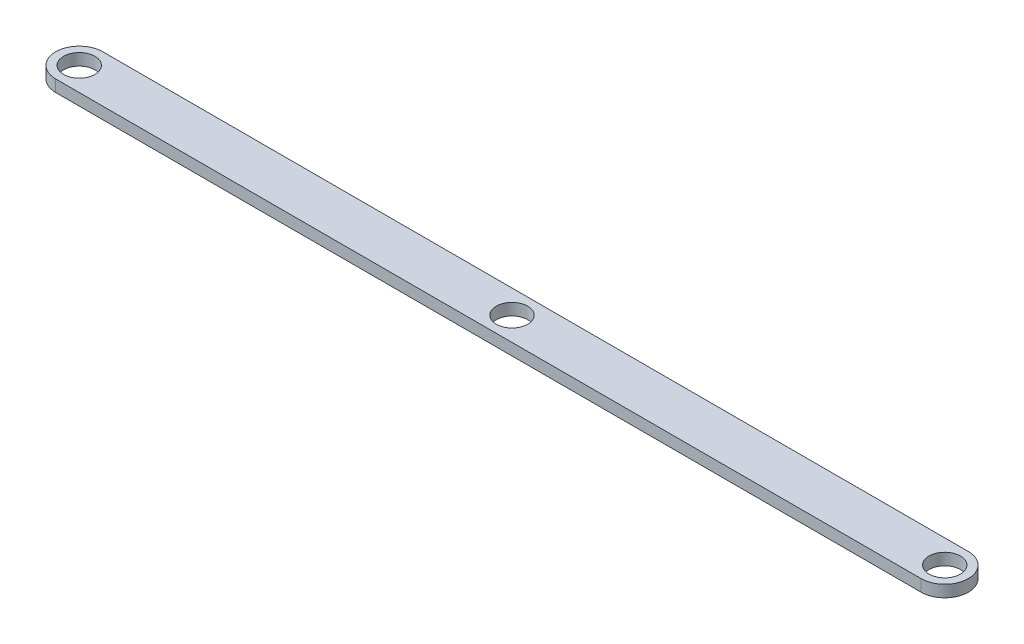
ISO-10303-21;
HEADER;
FILE_DESCRIPTION(('STEP AP214'),'2;1');
FILE_NAME('part.step','',(''),(''),'','','');
FILE_SCHEMA(('AUTOMOTIVE_DESIGN { 1 0 10303 214 1 1 1 1 }'));
ENDSEC;
DATA;
#1=APPLICATION_CONTEXT('core data for automotive mechanical design processes');
#2=APPLICATION_PROTOCOL_DEFINITION('international standard','automotive_design',2000,#1);
#3=PRODUCT_CONTEXT('',#1,'mechanical');
#4=PRODUCT('Part','Part','',(#3));
#5=PRODUCT_RELATED_PRODUCT_CATEGORY('part','',(#4));
#6=PRODUCT_DEFINITION_FORMATION('','',#4);
#7=PRODUCT_DEFINITION_CONTEXT('part definition',#1,'design');
#8=PRODUCT_DEFINITION('design','',#6,#7);
#9=PRODUCT_DEFINITION_SHAPE('','',#8);
#10=(LENGTH_UNIT() NAMED_UNIT(*) SI_UNIT(.MILLI.,.METRE.));
#11=(NAMED_UNIT(*) PLANE_ANGLE_UNIT() SI_UNIT($,.RADIAN.));
#12=(NAMED_UNIT(*) SI_UNIT($,.STERADIAN.) SOLID_ANGLE_UNIT());
#13=UNCERTAINTY_MEASURE_WITH_UNIT(LENGTH_MEASURE(1.E-05),#10,'distance_accuracy_value','');
#14=(GEOMETRIC_REPRESENTATION_CONTEXT(3) GLOBAL_UNCERTAINTY_ASSIGNED_CONTEXT((#13)) GLOBAL_UNIT_ASSIGNED_CONTEXT((#10,
#11,#12)) REPRESENTATION_CONTEXT('',''));
#15=CARTESIAN_POINT('',(0.,0.,0.));
#16=DIRECTION('',(0.,0.,1.));
#17=DIRECTION('',(1.,0.,0.));
#18=AXIS2_PLACEMENT_3D('',#15,#16,#17);
#19=CARTESIAN_POINT('',(0.,2.38125,4.7625));
#20=DIRECTION('',(0.,0.,-1.));
#21=DIRECTION('',(-1.,0.,0.));
#22=AXIS2_PLACEMENT_3D('',#19,#20,#21);
#23=PLANE('',#22);
#24=DIRECTION('',(1.,0.,0.));
#25=VECTOR('',#24,1.);
#26=CARTESIAN_POINT('',(0.,0.,4.7625));
#27=LINE('',#26,#25);
#28=CARTESIAN_POINT('',(-87.5,0.,4.7625));
#29=VERTEX_POINT('',#28);
#30=CARTESIAN_POINT('',(87.5,0.,4.7625));
#31=VERTEX_POINT('',#30);
#32=EDGE_CURVE('E122',#29,#31,#27,.T.);
#33=ORIENTED_EDGE('',*,*,#32,.T.);
#34=DIRECTION('',(0.,-1.,0.));
#35=VECTOR('',#34,1.);
#36=CARTESIAN_POINT('',(87.5,2.38125,4.7625));
#37=LINE('',#36,#35);
#38=CARTESIAN_POINT('',(87.5,2.38125,4.7625));
#39=VERTEX_POINT('',#38);
#40=EDGE_CURVE('E11',#39,#31,#37,.T.);
#41=ORIENTED_EDGE('',*,*,#40,.F.);
#42=DIRECTION('',(1.,0.,0.));
#43=VECTOR('',#42,1.);
#44=CARTESIAN_POINT('',(0.,2.38125,4.7625));
#45=LINE('',#44,#43);
#46=CARTESIAN_POINT('',(-87.5,2.38125,4.7625));
#47=VERTEX_POINT('',#46);
#48=EDGE_CURVE('E92',#47,#39,#45,.T.);
#49=ORIENTED_EDGE('',*,*,#48,.F.);
#50=DIRECTION('',(0.,-1.,0.));
#51=VECTOR('',#50,1.);
#52=CARTESIAN_POINT('',(-87.5,2.38125,4.7625));
#53=LINE('',#52,#51);
#54=EDGE_CURVE('E59',#47,#29,#53,.T.);
#55=ORIENTED_EDGE('',*,*,#54,.T.);
#56=EDGE_LOOP('',(#33,#41,#49,#55));
#57=FACE_BOUND('',#56,.T.);
#58=ADVANCED_FACE('F41',(#57),#23,.F.);
#59=CARTESIAN_POINT('',(87.5,2.38125,0.));
#60=DIRECTION('',(0.,-1.,0.));
#61=DIRECTION('',(0.,0.,-1.));
#62=AXIS2_PLACEMENT_3D('',#59,#60,#61);
#63=CYLINDRICAL_SURFACE('',#62,4.7625);
#64=CARTESIAN_POINT('',(87.5,0.,0.));
#65=DIRECTION('',(0.,1.,0.));
#66=DIRECTION('',(0.,0.,1.));
#67=AXIS2_PLACEMENT_3D('',#64,#65,#66);
#68=CIRCLE('',#67,4.7625);
#69=CARTESIAN_POINT('',(87.5,0.,-4.7625));
#70=VERTEX_POINT('',#69);
#71=EDGE_CURVE('E98',#31,#70,#68,.T.);
#72=ORIENTED_EDGE('',*,*,#71,.T.);
#73=DIRECTION('',(0.,-1.,0.));
#74=VECTOR('',#73,1.);
#75=CARTESIAN_POINT('',(87.5,2.38125,-4.7625));
#76=LINE('',#75,#74);
#77=CARTESIAN_POINT('',(87.5,2.38125,-4.7625));
#78=VERTEX_POINT('',#77);
#79=EDGE_CURVE('E51',#78,#70,#76,.T.);
#80=ORIENTED_EDGE('',*,*,#79,.F.);
#81=CARTESIAN_POINT('',(87.5,2.38125,0.));
#82=DIRECTION('',(0.,1.,0.));
#83=DIRECTION('',(0.,0.,1.));
#84=AXIS2_PLACEMENT_3D('',#81,#82,#83);
#85=CIRCLE('',#84,4.7625);
#86=EDGE_CURVE('E84',#39,#78,#85,.T.);
#87=ORIENTED_EDGE('',*,*,#86,.F.);
#88=ORIENTED_EDGE('',*,*,#40,.T.);
#89=EDGE_LOOP('',(#72,#80,#87,#88));
#90=FACE_BOUND('',#89,.T.);
#91=ADVANCED_FACE('F97',(#90),#63,.T.);
#92=CARTESIAN_POINT('',(0.,2.38125,-4.7625));
#93=DIRECTION('',(0.,0.,-1.));
#94=DIRECTION('',(-1.,0.,0.));
#95=AXIS2_PLACEMENT_3D('',#92,#93,#94);
#96=PLANE('',#95);
#97=DIRECTION('',(1.,0.,0.));
#98=VECTOR('',#97,1.);
#99=CARTESIAN_POINT('',(0.,0.,-4.7625));
#100=LINE('',#99,#98);
#101=CARTESIAN_POINT('',(-87.5,0.,-4.7625));
#102=VERTEX_POINT('',#101);
#103=EDGE_CURVE('E127',#102,#70,#100,.T.);
#104=ORIENTED_EDGE('',*,*,#103,.F.);
#105=DIRECTION('',(0.,-1.,0.));
#106=VECTOR('',#105,1.);
#107=CARTESIAN_POINT('',(-87.5,2.38125,-4.7625));
#108=LINE('',#107,#106);
#109=CARTESIAN_POINT('',(-87.5,2.38125,-4.7625));
#110=VERTEX_POINT('',#109);
#111=EDGE_CURVE('E73',#110,#102,#108,.T.);
#112=ORIENTED_EDGE('',*,*,#111,.F.);
#113=DIRECTION('',(1.,0.,0.));
#114=VECTOR('',#113,1.);
#115=CARTESIAN_POINT('',(0.,2.38125,-4.7625));
#116=LINE('',#115,#114);
#117=EDGE_CURVE('E91',#110,#78,#116,.T.);
#118=ORIENTED_EDGE('',*,*,#117,.T.);
#119=ORIENTED_EDGE('',*,*,#79,.T.);
#120=EDGE_LOOP('',(#104,#112,#118,#119));
#121=FACE_BOUND('',#120,.T.);
#122=ADVANCED_FACE('F102',(#121),#96,.T.);
#123=CARTESIAN_POINT('',(-87.5,2.38125,0.));
#124=DIRECTION('',(0.,-1.,0.));
#125=DIRECTION('',(0.,0.,-1.));
#126=AXIS2_PLACEMENT_3D('',#123,#124,#125);
#127=CYLINDRICAL_SURFACE('',#126,3.175);
#128=CARTESIAN_POINT('',(-87.5,2.38125,0.));
#129=DIRECTION('',(0.,1.,0.));
#130=DIRECTION('',(0.,0.,1.));
#131=AXIS2_PLACEMENT_3D('',#128,#129,#130);
#132=CIRCLE('',#131,3.175);
#133=CARTESIAN_POINT('',(-87.5,2.38125,-3.175));
#134=VERTEX_POINT('',#133);
#135=EDGE_CURVE('E147',#134,#134,#132,.T.);
#136=CARTESIAN_POINT('',(-87.5,0.,0.));
#137=DIRECTION('',(0.,1.,0.));
#138=DIRECTION('',(0.,0.,1.));
#139=AXIS2_PLACEMENT_3D('',#136,#137,#138);
#140=CIRCLE('',#139,3.175);
#141=CARTESIAN_POINT('',(-87.5,0.,-3.175));
#142=VERTEX_POINT('',#141);
#143=EDGE_CURVE('E118',#142,#142,#140,.T.);
#144=CARTESIAN_POINT('',(-87.5,2.38125,-3.175));
#145=CARTESIAN_POINT('',(-87.5,2.3564453125,-3.175));
#146=CARTESIAN_POINT('',(-87.5,2.331640625,-3.175));
#147=CARTESIAN_POINT('',(-87.5,2.28203125,-3.175));
#148=CARTESIAN_POINT('',(-87.5,2.2572265625,-3.175));
#149=CARTESIAN_POINT('',(-87.5,2.2076171875,-3.175));
#150=CARTESIAN_POINT('',(-87.5,2.1828125,-3.175));
#151=CARTESIAN_POINT('',(-87.5,2.133203125,-3.175));
#152=CARTESIAN_POINT('',(-87.5,2.1083984375,-3.175));
#153=CARTESIAN_POINT('',(-87.5,2.0587890625,-3.175));
#154=CARTESIAN_POINT('',(-87.5,2.033984375,-3.175));
#155=CARTESIAN_POINT('',(-87.5,1.984375,-3.175));
#156=CARTESIAN_POINT('',(-87.5,1.9595703125,-3.175));
#157=CARTESIAN_POINT('',(-87.5,1.9099609375,-3.175));
#158=CARTESIAN_POINT('',(-87.5,1.88515625,-3.175));
#159=CARTESIAN_POINT('',(-87.5,1.835546875,-3.175));
#160=CARTESIAN_POINT('',(-87.5,1.8107421875,-3.175));
#161=CARTESIAN_POINT('',(-87.5,1.7611328125,-3.175));
#162=CARTESIAN_POINT('',(-87.5,1.736328125,-3.175));
#163=CARTESIAN_POINT('',(-87.5,1.68671875,-3.175));
#164=CARTESIAN_POINT('',(-87.5,1.6619140625,-3.175));
#165=CARTESIAN_POINT('',(-87.5,1.6123046875,-3.175));
#166=CARTESIAN_POINT('',(-87.5,1.5875,-3.175));
#167=CARTESIAN_POINT('',(-87.5,1.537890625,-3.175));
#168=CARTESIAN_POINT('',(-87.5,1.5130859375,-3.175));
#169=CARTESIAN_POINT('',(-87.5,1.4634765625,-3.175));
#170=CARTESIAN_POINT('',(-87.5,1.438671875,-3.175));
#171=CARTESIAN_POINT('',(-87.5,1.3890625,-3.175));
#172=CARTESIAN_POINT('',(-87.5,1.3642578125,-3.175));
#173=CARTESIAN_POINT('',(-87.5,1.3146484375,-3.175));
#174=CARTESIAN_POINT('',(-87.5,1.28984375,-3.175));
#175=CARTESIAN_POINT('',(-87.5,1.240234375,-3.175));
#176=CARTESIAN_POINT('',(-87.5,1.2154296875,-3.175));
#177=CARTESIAN_POINT('',(-87.5,1.1658203125,-3.175));
#178=CARTESIAN_POINT('',(-87.5,1.141015625,-3.175));
#179=CARTESIAN_POINT('',(-87.5,1.09140625,-3.175));
#180=CARTESIAN_POINT('',(-87.5,1.0666015625,-3.175));
#181=CARTESIAN_POINT('',(-87.5,1.0169921875,-3.175));
#182=CARTESIAN_POINT('',(-87.5,0.9921875,-3.175));
#183=CARTESIAN_POINT('',(-87.5,0.942578125,-3.175));
#184=CARTESIAN_POINT('',(-87.5,0.9177734375,-3.175));
#185=CARTESIAN_POINT('',(-87.5,0.8681640625,-3.175));
#186=CARTESIAN_POINT('',(-87.5,0.843359375,-3.175));
#187=CARTESIAN_POINT('',(-87.5,0.79375,-3.175));
#188=CARTESIAN_POINT('',(-87.5,0.7689453125,-3.175));
#189=CARTESIAN_POINT('',(-87.5,0.7193359375,-3.175));
#190=CARTESIAN_POINT('',(-87.5,0.69453125,-3.175));
#191=CARTESIAN_POINT('',(-87.5,0.644921875,-3.175));
#192=CARTESIAN_POINT('',(-87.5,0.6201171875,-3.175));
#193=CARTESIAN_POINT('',(-87.5,0.5705078125,-3.175));
#194=CARTESIAN_POINT('',(-87.5,0.545703125,-3.175));
#195=CARTESIAN_POINT('',(-87.5,0.49609375,-3.175));
#196=CARTESIAN_POINT('',(-87.5,0.4712890625,-3.175));
#197=CARTESIAN_POINT('',(-87.5,0.4216796875,-3.175));
#198=CARTESIAN_POINT('',(-87.5,0.396875,-3.175));
#199=CARTESIAN_POINT('',(-87.5,0.347265625,-3.175));
#200=CARTESIAN_POINT('',(-87.5,0.3224609375,-3.175));
#201=CARTESIAN_POINT('',(-87.5,0.2728515625,-3.175));
#202=CARTESIAN_POINT('',(-87.5,0.248046875,-3.175));
#203=CARTESIAN_POINT('',(-87.5,0.1984375,-3.175));
#204=CARTESIAN_POINT('',(-87.5,0.1736328125,-3.175));
#205=CARTESIAN_POINT('',(-87.5,0.1240234375,-3.175));
#206=CARTESIAN_POINT('',(-87.5,0.0992187500000001,-3.175));
#207=CARTESIAN_POINT('',(-87.5,0.049609375,-3.175));
#208=CARTESIAN_POINT('',(-87.5,0.0248046875,-3.175));
#209=CARTESIAN_POINT('',(-87.5,0.,-3.175));
#210=B_SPLINE_CURVE_WITH_KNOTS('',3,(#144,#145,#146,#147,#148,#149,#150,#151,#152,#153,#154,
#155,#156,#157,#158,#159,#160,#161,#162,#163,#164,#165,#166,#167,#168,#169,#170,#171,#172,#173,
#174,#175,#176,#177,#178,#179,#180,#181,#182,#183,#184,#185,#186,#187,#188,#189,#190,#191,#192,
#193,#194,#195,#196,#197,#198,#199,#200,#201,#202,#203,#204,#205,#206,#207,#208,#209),
.UNSPECIFIED.,.F.,.F.,(4,2,2,2,2,2,2,2,2,2,2,2,2,2,2,2,2,2,2,2,2,2,2,2,2,2,2,2,2,2,2,2,4),(0.,
0.0744140625,0.148828125,0.2232421875,0.29765625,0.3720703125,0.446484375,0.5208984375,
0.5953125,0.6697265625,0.744140625,0.8185546875,0.89296875,0.9673828125,1.041796875,
1.1162109375,1.190625,1.2650390625,1.339453125,1.4138671875,1.48828125,1.5626953125,1.637109375,
1.7115234375,1.7859375,1.8603515625,1.934765625,2.0091796875,2.08359375,2.1580078125,
2.232421875,2.3068359375,2.38125),.UNSPECIFIED.);
#211=EDGE_CURVE('BSEAM155',#134,#142,#210,.T.);
#212=ORIENTED_EDGE('',*,*,#135,.T.);
#213=ORIENTED_EDGE('',*,*,#143,.F.);
#214=ORIENTED_EDGE('',*,*,#211,.T.);
#215=ORIENTED_EDGE('',*,*,#211,.F.);
#216=EDGE_LOOP('',(#212,#214,#213,#215));
#217=FACE_BOUND('',#216,.T.);
#218=ADVANCED_FACE('F155',(#217),#127,.F.);
#219=CARTESIAN_POINT('',(0.,2.38125,0.));
#220=DIRECTION('',(0.,-1.,0.));
#221=DIRECTION('',(0.,0.,-1.));
#222=AXIS2_PLACEMENT_3D('',#219,#220,#221);
#223=CYLINDRICAL_SURFACE('',#222,3.175);
#224=CARTESIAN_POINT('',(0.,2.38125,0.));
#225=DIRECTION('',(0.,1.,0.));
#226=DIRECTION('',(0.,0.,1.));
#227=AXIS2_PLACEMENT_3D('',#224,#225,#226);
#228=CIRCLE('',#227,3.175);
#229=CARTESIAN_POINT('',(0.,2.38125,-3.17500000000002));
#230=VERTEX_POINT('',#229);
#231=EDGE_CURVE('E141',#230,#230,#228,.T.);
#232=CARTESIAN_POINT('',(0.,0.,0.));
#233=DIRECTION('',(0.,1.,0.));
#234=DIRECTION('',(0.,0.,1.));
#235=AXIS2_PLACEMENT_3D('',#232,#233,#234);
#236=CIRCLE('',#235,3.175);
#237=CARTESIAN_POINT('',(0.,0.,-3.17500000000002));
#238=VERTEX_POINT('',#237);
#239=EDGE_CURVE('E114',#238,#238,#236,.T.);
#240=CARTESIAN_POINT('',(0.,2.38125,-3.17500000000002));
#241=CARTESIAN_POINT('',(0.,2.3564453125,-3.17500000000002));
#242=CARTESIAN_POINT('',(0.,2.331640625,-3.17500000000002));
#243=CARTESIAN_POINT('',(0.,2.28203125,-3.17500000000002));
#244=CARTESIAN_POINT('',(0.,2.2572265625,-3.17500000000002));
#245=CARTESIAN_POINT('',(0.,2.2076171875,-3.17500000000002));
#246=CARTESIAN_POINT('',(0.,2.1828125,-3.17500000000002));
#247=CARTESIAN_POINT('',(0.,2.133203125,-3.17500000000002));
#248=CARTESIAN_POINT('',(0.,2.1083984375,-3.17500000000002));
#249=CARTESIAN_POINT('',(0.,2.0587890625,-3.17500000000002));
#250=CARTESIAN_POINT('',(0.,2.033984375,-3.17500000000002));
#251=CARTESIAN_POINT('',(0.,1.984375,-3.17500000000002));
#252=CARTESIAN_POINT('',(0.,1.9595703125,-3.17500000000002));
#253=CARTESIAN_POINT('',(0.,1.9099609375,-3.17500000000002));
#254=CARTESIAN_POINT('',(0.,1.88515625,-3.17500000000002));
#255=CARTESIAN_POINT('',(0.,1.835546875,-3.17500000000002));
#256=CARTESIAN_POINT('',(0.,1.8107421875,-3.17500000000002));
#257=CARTESIAN_POINT('',(0.,1.7611328125,-3.17500000000002));
#258=CARTESIAN_POINT('',(0.,1.736328125,-3.17500000000002));
#259=CARTESIAN_POINT('',(0.,1.68671875,-3.17500000000002));
#260=CARTESIAN_POINT('',(0.,1.6619140625,-3.17500000000002));
#261=CARTESIAN_POINT('',(0.,1.6123046875,-3.17500000000002));
#262=CARTESIAN_POINT('',(0.,1.5875,-3.17500000000002));
#263=CARTESIAN_POINT('',(0.,1.537890625,-3.17500000000002));
#264=CARTESIAN_POINT('',(0.,1.5130859375,-3.17500000000002));
#265=CARTESIAN_POINT('',(0.,1.4634765625,-3.17500000000002));
#266=CARTESIAN_POINT('',(0.,1.438671875,-3.17500000000002));
#267=CARTESIAN_POINT('',(0.,1.3890625,-3.17500000000002));
#268=CARTESIAN_POINT('',(0.,1.3642578125,-3.17500000000002));
#269=CARTESIAN_POINT('',(0.,1.3146484375,-3.17500000000002));
#270=CARTESIAN_POINT('',(0.,1.28984375,-3.17500000000002));
#271=CARTESIAN_POINT('',(0.,1.240234375,-3.17500000000002));
#272=CARTESIAN_POINT('',(0.,1.2154296875,-3.17500000000002));
#273=CARTESIAN_POINT('',(0.,1.1658203125,-3.17500000000002));
#274=CARTESIAN_POINT('',(0.,1.141015625,-3.17500000000002));
#275=CARTESIAN_POINT('',(0.,1.09140625,-3.17500000000002));
#276=CARTESIAN_POINT('',(0.,1.0666015625,-3.17500000000002));
#277=CARTESIAN_POINT('',(0.,1.0169921875,-3.17500000000002));
#278=CARTESIAN_POINT('',(0.,0.9921875,-3.17500000000002));
#279=CARTESIAN_POINT('',(0.,0.942578125,-3.17500000000002));
#280=CARTESIAN_POINT('',(0.,0.9177734375,-3.17500000000002));
#281=CARTESIAN_POINT('',(0.,0.8681640625,-3.17500000000002));
#282=CARTESIAN_POINT('',(0.,0.843359375,-3.17500000000002));
#283=CARTESIAN_POINT('',(0.,0.79375,-3.17500000000002));
#284=CARTESIAN_POINT('',(0.,0.7689453125,-3.17500000000002));
#285=CARTESIAN_POINT('',(0.,0.7193359375,-3.17500000000002));
#286=CARTESIAN_POINT('',(0.,0.69453125,-3.17500000000002));
#287=CARTESIAN_POINT('',(0.,0.644921875,-3.17500000000002));
#288=CARTESIAN_POINT('',(0.,0.6201171875,-3.17500000000002));
#289=CARTESIAN_POINT('',(0.,0.5705078125,-3.17500000000002));
#290=CARTESIAN_POINT('',(0.,0.545703125,-3.17500000000002));
#291=CARTESIAN_POINT('',(0.,0.49609375,-3.17500000000002));
#292=CARTESIAN_POINT('',(0.,0.4712890625,-3.17500000000002));
#293=CARTESIAN_POINT('',(0.,0.4216796875,-3.17500000000002));
#294=CARTESIAN_POINT('',(0.,0.396875,-3.17500000000002));
#295=CARTESIAN_POINT('',(0.,0.347265625,-3.17500000000002));
#296=CARTESIAN_POINT('',(0.,0.3224609375,-3.17500000000002));
#297=CARTESIAN_POINT('',(0.,0.2728515625,-3.17500000000002));
#298=CARTESIAN_POINT('',(0.,0.248046875,-3.17500000000002));
#299=CARTESIAN_POINT('',(0.,0.1984375,-3.17500000000002));
#300=CARTESIAN_POINT('',(0.,0.1736328125,-3.17500000000002));
#301=CARTESIAN_POINT('',(0.,0.1240234375,-3.17500000000002));
#302=CARTESIAN_POINT('',(0.,0.0992187500000001,-3.17500000000002));
#303=CARTESIAN_POINT('',(0.,0.049609375,-3.17500000000002));
#304=CARTESIAN_POINT('',(0.,0.0248046875,-3.17500000000002));
#305=CARTESIAN_POINT('',(0.,0.,-3.17500000000002));
#306=B_SPLINE_CURVE_WITH_KNOTS('',3,(#240,#241,#242,#243,#244,#245,#246,#247,#248,#249,#250,
#251,#252,#253,#254,#255,#256,#257,#258,#259,#260,#261,#262,#263,#264,#265,#266,#267,#268,#269,
#270,#271,#272,#273,#274,#275,#276,#277,#278,#279,#280,#281,#282,#283,#284,#285,#286,#287,#288,
#289,#290,#291,#292,#293,#294,#295,#296,#297,#298,#299,#300,#301,#302,#303,#304,#305),
.UNSPECIFIED.,.F.,.F.,(4,2,2,2,2,2,2,2,2,2,2,2,2,2,2,2,2,2,2,2,2,2,2,2,2,2,2,2,2,2,2,2,4),(0.,
0.0744140625,0.148828125,0.2232421875,0.29765625,0.3720703125,0.446484375,0.5208984375,
0.5953125,0.6697265625,0.744140625,0.8185546875,0.89296875,0.9673828125,1.041796875,
1.1162109375,1.190625,1.2650390625,1.339453125,1.4138671875,1.48828125,1.5626953125,1.637109375,
1.7115234375,1.7859375,1.8603515625,1.934765625,2.0091796875,2.08359375,2.1580078125,
2.232421875,2.3068359375,2.38125),.UNSPECIFIED.);
#307=EDGE_CURVE('BSEAM180',#230,#238,#306,.T.);
#308=ORIENTED_EDGE('',*,*,#231,.T.);
#309=ORIENTED_EDGE('',*,*,#239,.F.);
#310=ORIENTED_EDGE('',*,*,#307,.T.);
#311=ORIENTED_EDGE('',*,*,#307,.F.);
#312=EDGE_LOOP('',(#308,#310,#309,#311));
#313=FACE_BOUND('',#312,.T.);
#314=ADVANCED_FACE('F180',(#313),#223,.F.);
#315=CARTESIAN_POINT('',(87.5,2.38125,0.));
#316=DIRECTION('',(0.,-1.,0.));
#317=DIRECTION('',(0.,0.,-1.));
#318=AXIS2_PLACEMENT_3D('',#315,#316,#317);
#319=CYLINDRICAL_SURFACE('',#318,3.175);
#320=CARTESIAN_POINT('',(87.5,2.38125,0.));
#321=DIRECTION('',(0.,1.,0.));
#322=DIRECTION('',(0.,0.,1.));
#323=AXIS2_PLACEMENT_3D('',#320,#321,#322);
#324=CIRCLE('',#323,3.175);
#325=CARTESIAN_POINT('',(87.5,2.38125,-3.17500000000003));
#326=VERTEX_POINT('',#325);
#327=EDGE_CURVE('E134',#326,#326,#324,.T.);
#328=CARTESIAN_POINT('',(87.5,0.,0.));
#329=DIRECTION('',(0.,1.,0.));
#330=DIRECTION('',(0.,0.,1.));
#331=AXIS2_PLACEMENT_3D('',#328,#329,#330);
#332=CIRCLE('',#331,3.175);
#333=CARTESIAN_POINT('',(87.5,0.,-3.17500000000003));
#334=VERTEX_POINT('',#333);
#335=EDGE_CURVE('E110',#334,#334,#332,.T.);
#336=CARTESIAN_POINT('',(87.5,2.38125,-3.17500000000003));
#337=CARTESIAN_POINT('',(87.5,2.3564453125,-3.17500000000003));
#338=CARTESIAN_POINT('',(87.5,2.331640625,-3.17500000000003));
#339=CARTESIAN_POINT('',(87.5,2.28203125,-3.17500000000003));
#340=CARTESIAN_POINT('',(87.5,2.2572265625,-3.17500000000003));
#341=CARTESIAN_POINT('',(87.5,2.2076171875,-3.17500000000003));
#342=CARTESIAN_POINT('',(87.5,2.1828125,-3.17500000000003));
#343=CARTESIAN_POINT('',(87.5,2.133203125,-3.17500000000003));
#344=CARTESIAN_POINT('',(87.5,2.1083984375,-3.17500000000003));
#345=CARTESIAN_POINT('',(87.5,2.0587890625,-3.17500000000003));
#346=CARTESIAN_POINT('',(87.5,2.033984375,-3.17500000000003));
#347=CARTESIAN_POINT('',(87.5,1.984375,-3.17500000000003));
#348=CARTESIAN_POINT('',(87.5,1.9595703125,-3.17500000000003));
#349=CARTESIAN_POINT('',(87.5,1.9099609375,-3.17500000000003));
#350=CARTESIAN_POINT('',(87.5,1.88515625,-3.17500000000003));
#351=CARTESIAN_POINT('',(87.5,1.835546875,-3.17500000000003));
#352=CARTESIAN_POINT('',(87.5,1.8107421875,-3.17500000000003));
#353=CARTESIAN_POINT('',(87.5,1.7611328125,-3.17500000000003));
#354=CARTESIAN_POINT('',(87.5,1.736328125,-3.17500000000003));
#355=CARTESIAN_POINT('',(87.5,1.68671875,-3.17500000000003));
#356=CARTESIAN_POINT('',(87.5,1.6619140625,-3.17500000000003));
#357=CARTESIAN_POINT('',(87.5,1.6123046875,-3.17500000000003));
#358=CARTESIAN_POINT('',(87.5,1.5875,-3.17500000000003));
#359=CARTESIAN_POINT('',(87.5,1.537890625,-3.17500000000003));
#360=CARTESIAN_POINT('',(87.5,1.5130859375,-3.17500000000003));
#361=CARTESIAN_POINT('',(87.5,1.4634765625,-3.17500000000003));
#362=CARTESIAN_POINT('',(87.5,1.438671875,-3.17500000000003));
#363=CARTESIAN_POINT('',(87.5,1.3890625,-3.17500000000003));
#364=CARTESIAN_POINT('',(87.5,1.3642578125,-3.17500000000003));
#365=CARTESIAN_POINT('',(87.5,1.3146484375,-3.17500000000003));
#366=CARTESIAN_POINT('',(87.5,1.28984375,-3.17500000000003));
#367=CARTESIAN_POINT('',(87.5,1.240234375,-3.17500000000003));
#368=CARTESIAN_POINT('',(87.5,1.2154296875,-3.17500000000003));
#369=CARTESIAN_POINT('',(87.5,1.1658203125,-3.17500000000003));
#370=CARTESIAN_POINT('',(87.5,1.141015625,-3.17500000000003));
#371=CARTESIAN_POINT('',(87.5,1.09140625,-3.17500000000003));
#372=CARTESIAN_POINT('',(87.5,1.0666015625,-3.17500000000003));
#373=CARTESIAN_POINT('',(87.5,1.0169921875,-3.17500000000003));
#374=CARTESIAN_POINT('',(87.5,0.9921875,-3.17500000000003));
#375=CARTESIAN_POINT('',(87.5,0.942578125,-3.17500000000003));
#376=CARTESIAN_POINT('',(87.5,0.9177734375,-3.17500000000003));
#377=CARTESIAN_POINT('',(87.5,0.8681640625,-3.17500000000003));
#378=CARTESIAN_POINT('',(87.5,0.843359375,-3.17500000000003));
#379=CARTESIAN_POINT('',(87.5,0.79375,-3.17500000000003));
#380=CARTESIAN_POINT('',(87.5,0.7689453125,-3.17500000000003));
#381=CARTESIAN_POINT('',(87.5,0.7193359375,-3.17500000000003));
#382=CARTESIAN_POINT('',(87.5,0.69453125,-3.17500000000003));
#383=CARTESIAN_POINT('',(87.5,0.644921875,-3.17500000000003));
#384=CARTESIAN_POINT('',(87.5,0.6201171875,-3.17500000000003));
#385=CARTESIAN_POINT('',(87.5,0.5705078125,-3.17500000000003));
#386=CARTESIAN_POINT('',(87.5,0.545703125,-3.17500000000003));
#387=CARTESIAN_POINT('',(87.5,0.49609375,-3.17500000000003));
#388=CARTESIAN_POINT('',(87.5,0.4712890625,-3.17500000000003));
#389=CARTESIAN_POINT('',(87.5,0.4216796875,-3.17500000000003));
#390=CARTESIAN_POINT('',(87.5,0.396875,-3.17500000000003));
#391=CARTESIAN_POINT('',(87.5,0.347265625,-3.17500000000003));
#392=CARTESIAN_POINT('',(87.5,0.3224609375,-3.17500000000003));
#393=CARTESIAN_POINT('',(87.5,0.2728515625,-3.17500000000003));
#394=CARTESIAN_POINT('',(87.5,0.248046875,-3.17500000000003));
#395=CARTESIAN_POINT('',(87.5,0.1984375,-3.17500000000003));
#396=CARTESIAN_POINT('',(87.5,0.1736328125,-3.17500000000003));
#397=CARTESIAN_POINT('',(87.5,0.1240234375,-3.17500000000003));
#398=CARTESIAN_POINT('',(87.5,0.0992187500000001,-3.17500000000003));
#399=CARTESIAN_POINT('',(87.5,0.049609375,-3.17500000000003));
#400=CARTESIAN_POINT('',(87.5,0.0248046875,-3.17500000000003));
#401=CARTESIAN_POINT('',(87.5,0.,-3.17500000000003));
#402=B_SPLINE_CURVE_WITH_KNOTS('',3,(#336,#337,#338,#339,#340,#341,#342,#343,#344,#345,#346,
#347,#348,#349,#350,#351,#352,#353,#354,#355,#356,#357,#358,#359,#360,#361,#362,#363,#364,#365,
#366,#367,#368,#369,#370,#371,#372,#373,#374,#375,#376,#377,#378,#379,#380,#381,#382,#383,#384,
#385,#386,#387,#388,#389,#390,#391,#392,#393,#394,#395,#396,#397,#398,#399,#400,#401),
.UNSPECIFIED.,.F.,.F.,(4,2,2,2,2,2,2,2,2,2,2,2,2,2,2,2,2,2,2,2,2,2,2,2,2,2,2,2,2,2,2,2,4),(0.,
0.0744140625,0.148828125,0.2232421875,0.29765625,0.3720703125,0.446484375,0.5208984375,
0.5953125,0.6697265625,0.744140625,0.8185546875,0.89296875,0.9673828125,1.041796875,
1.1162109375,1.190625,1.2650390625,1.339453125,1.4138671875,1.48828125,1.5626953125,1.637109375,
1.7115234375,1.7859375,1.8603515625,1.934765625,2.0091796875,2.08359375,2.1580078125,
2.232421875,2.3068359375,2.38125),.UNSPECIFIED.);
#403=EDGE_CURVE('BSEAM43',#326,#334,#402,.T.);
#404=ORIENTED_EDGE('',*,*,#327,.T.);
#405=ORIENTED_EDGE('',*,*,#335,.F.);
#406=ORIENTED_EDGE('',*,*,#403,.T.);
#407=ORIENTED_EDGE('',*,*,#403,.F.);
#408=EDGE_LOOP('',(#404,#406,#405,#407));
#409=FACE_BOUND('',#408,.T.);
#410=ADVANCED_FACE('F43',(#409),#319,.F.);
#411=CARTESIAN_POINT('',(-87.5,2.38125,0.));
#412=DIRECTION('',(0.,-1.,0.));
#413=DIRECTION('',(0.,0.,-1.));
#414=AXIS2_PLACEMENT_3D('',#411,#412,#413);
#415=CYLINDRICAL_SURFACE('',#414,4.7625);
#416=CARTESIAN_POINT('',(-87.5,0.,0.));
#417=DIRECTION('',(0.,1.,0.));
#418=DIRECTION('',(0.,0.,1.));
#419=AXIS2_PLACEMENT_3D('',#416,#417,#418);
#420=CIRCLE('',#419,4.7625);
#421=EDGE_CURVE('E130',#29,#102,#420,.F.);
#422=ORIENTED_EDGE('',*,*,#421,.F.);
#423=ORIENTED_EDGE('',*,*,#54,.F.);
#424=CARTESIAN_POINT('',(-87.5,2.38125,0.));
#425=DIRECTION('',(0.,1.,0.));
#426=DIRECTION('',(0.,0.,1.));
#427=AXIS2_PLACEMENT_3D('',#424,#425,#426);
#428=CIRCLE('',#427,4.7625);
#429=EDGE_CURVE('E104',#47,#110,#428,.F.);
#430=ORIENTED_EDGE('',*,*,#429,.T.);
#431=ORIENTED_EDGE('',*,*,#111,.T.);
#432=EDGE_LOOP('',(#422,#423,#430,#431));
#433=FACE_BOUND('',#432,.T.);
#434=ADVANCED_FACE('F160',(#433),#415,.T.);
#435=CARTESIAN_POINT('',(0.,2.38125,0.));
#436=DIRECTION('',(0.,1.,0.));
#437=DIRECTION('',(0.,0.,1.));
#438=AXIS2_PLACEMENT_3D('',#435,#436,#437);
#439=PLANE('',#438);
#440=ORIENTED_EDGE('',*,*,#327,.F.);
#441=EDGE_LOOP('',(#440));
#442=FACE_BOUND('',#441,.T.);
#443=ORIENTED_EDGE('',*,*,#231,.F.);
#444=EDGE_LOOP('',(#443));
#445=FACE_BOUND('',#444,.T.);
#446=ORIENTED_EDGE('',*,*,#135,.F.);
#447=EDGE_LOOP('',(#446));
#448=FACE_BOUND('',#447,.T.);
#449=ORIENTED_EDGE('',*,*,#48,.T.);
#450=ORIENTED_EDGE('',*,*,#86,.T.);
#451=ORIENTED_EDGE('',*,*,#117,.F.);
#452=ORIENTED_EDGE('',*,*,#429,.F.);
#453=EDGE_LOOP('',(#449,#450,#451,#452));
#454=FACE_BOUND('',#453,.T.);
#455=ADVANCED_FACE('F88',(#442,#445,#448,#454),#439,.T.);
#456=CARTESIAN_POINT('',(0.,0.,0.));
#457=DIRECTION('',(0.,1.,0.));
#458=DIRECTION('',(0.,0.,1.));
#459=AXIS2_PLACEMENT_3D('',#456,#457,#458);
#460=PLANE('',#459);
#461=ORIENTED_EDGE('',*,*,#335,.T.);
#462=EDGE_LOOP('',(#461));
#463=FACE_BOUND('',#462,.T.);
#464=ORIENTED_EDGE('',*,*,#239,.T.);
#465=EDGE_LOOP('',(#464));
#466=FACE_BOUND('',#465,.T.);
#467=ORIENTED_EDGE('',*,*,#143,.T.);
#468=EDGE_LOOP('',(#467));
#469=FACE_BOUND('',#468,.T.);
#470=ORIENTED_EDGE('',*,*,#32,.F.);
#471=ORIENTED_EDGE('',*,*,#421,.T.);
#472=ORIENTED_EDGE('',*,*,#103,.T.);
#473=ORIENTED_EDGE('',*,*,#71,.F.);
#474=EDGE_LOOP('',(#470,#471,#472,#473));
#475=FACE_BOUND('',#474,.T.);
#476=ADVANCED_FACE('F159',(#463,#466,#469,#475),#460,.F.);
#477=CLOSED_SHELL('',(#58,#91,#122,#218,#314,#410,#434,#455,#476));
#478=MANIFOLD_SOLID_BREP('B2',#477);
#479=ADVANCED_BREP_SHAPE_REPRESENTATION('',(#18,#478),#14);
#480=SHAPE_DEFINITION_REPRESENTATION(#9,#479);
ENDSEC;
END-ISO-10303-21;
